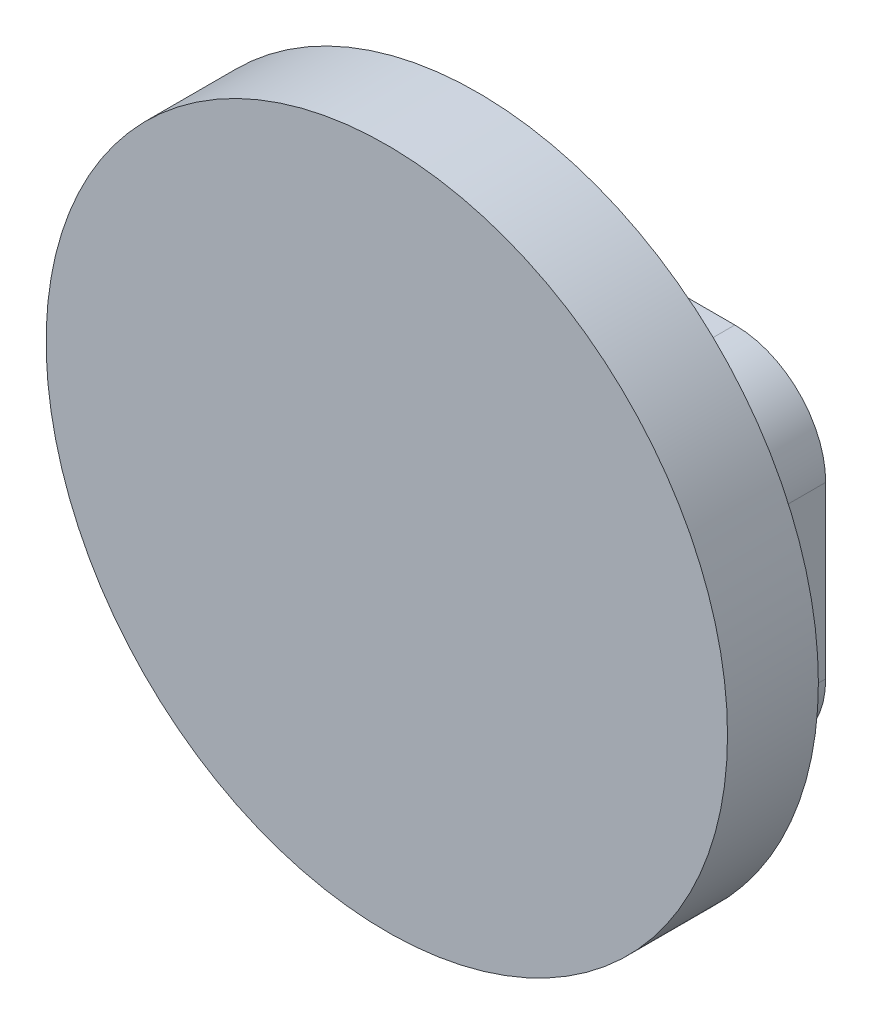
ISO-10303-21;
HEADER;
FILE_DESCRIPTION(('STEP AP214'),'2;1');
FILE_NAME('part.step','',(''),(''),'','','');
FILE_SCHEMA(('AUTOMOTIVE_DESIGN { 1 0 10303 214 1 1 1 1 }'));
ENDSEC;
DATA;
#1=APPLICATION_CONTEXT('core data for automotive mechanical design processes');
#2=APPLICATION_PROTOCOL_DEFINITION('international standard','automotive_design',2000,#1);
#3=PRODUCT_CONTEXT('',#1,'mechanical');
#4=PRODUCT('Part','Part','',(#3));
#5=PRODUCT_RELATED_PRODUCT_CATEGORY('part','',(#4));
#6=PRODUCT_DEFINITION_FORMATION('','',#4);
#7=PRODUCT_DEFINITION_CONTEXT('part definition',#1,'design');
#8=PRODUCT_DEFINITION('design','',#6,#7);
#9=PRODUCT_DEFINITION_SHAPE('','',#8);
#10=(LENGTH_UNIT() NAMED_UNIT(*) SI_UNIT(.MILLI.,.METRE.));
#11=(NAMED_UNIT(*) PLANE_ANGLE_UNIT() SI_UNIT($,.RADIAN.));
#12=(NAMED_UNIT(*) SI_UNIT($,.STERADIAN.) SOLID_ANGLE_UNIT());
#13=UNCERTAINTY_MEASURE_WITH_UNIT(LENGTH_MEASURE(1.E-05),#10,'distance_accuracy_value','');
#14=(GEOMETRIC_REPRESENTATION_CONTEXT(3) GLOBAL_UNCERTAINTY_ASSIGNED_CONTEXT((#13)) GLOBAL_UNIT_ASSIGNED_CONTEXT((#10,
#11,#12)) REPRESENTATION_CONTEXT('',''));
#15=CARTESIAN_POINT('',(0.,0.,0.));
#16=DIRECTION('',(0.,0.,1.));
#17=DIRECTION('',(1.,0.,0.));
#18=AXIS2_PLACEMENT_3D('',#15,#16,#17);
#19=CARTESIAN_POINT('',(11.9455168582029,0.,0.));
#20=DIRECTION('',(0.,0.,1.));
#21=DIRECTION('',(1.,0.,0.));
#22=AXIS2_PLACEMENT_3D('',#19,#20,#21);
#23=PLANE('',#22);
#24=CARTESIAN_POINT('',(11.9455168582029,0.,0.));
#25=DIRECTION('',(0.,0.,1.));
#26=DIRECTION('',(1.,0.,0.));
#27=AXIS2_PLACEMENT_3D('',#24,#25,#26);
#28=CIRCLE('',#27,37.5);
#29=CARTESIAN_POINT('',(49.445516858203,0.,0.));
#30=VERTEX_POINT('',#29);
#31=EDGE_CURVE('E44',#30,#30,#28,.T.);
#32=ORIENTED_EDGE('',*,*,#31,.F.);
#33=EDGE_LOOP('',(#32));
#34=FACE_BOUND('',#33,.T.);
#35=CARTESIAN_POINT('',(30.25,-9.24462078190565,0.));
#36=DIRECTION('',(0.,0.,-1.));
#37=DIRECTION('',(1.,0.,0.));
#38=AXIS2_PLACEMENT_3D('',#35,#36,#37);
#39=CIRCLE('',#38,10.);
#40=CARTESIAN_POINT('',(40.25,-9.24462078190565,0.));
#41=VERTEX_POINT('',#40);
#42=CARTESIAN_POINT('',(30.2392473184413,-19.2446150008959,0.));
#43=VERTEX_POINT('',#42);
#44=EDGE_CURVE('E57',#41,#43,#39,.T.);
#45=ORIENTED_EDGE('',*,*,#44,.F.);
#46=DIRECTION('',(0.,-1.,0.));
#47=VECTOR('',#46,1.);
#48=CARTESIAN_POINT('',(40.25,9.4843249413072,0.));
#49=LINE('',#48,#47);
#50=CARTESIAN_POINT('',(40.25,9.4843249413072,0.));
#51=VERTEX_POINT('',#50);
#52=EDGE_CURVE('E58',#51,#41,#49,.T.);
#53=ORIENTED_EDGE('',*,*,#52,.F.);
#54=CARTESIAN_POINT('',(30.25,9.4843249413072,0.));
#55=DIRECTION('',(0.,0.,-1.));
#56=DIRECTION('',(-1.,0.,0.));
#57=AXIS2_PLACEMENT_3D('',#54,#55,#56);
#58=CIRCLE('',#57,10.);
#59=CARTESIAN_POINT('',(30.25,19.4843249413072,0.));
#60=VERTEX_POINT('',#59);
#61=EDGE_CURVE('E202',#60,#51,#58,.T.);
#62=ORIENTED_EDGE('',*,*,#61,.F.);
#63=DIRECTION('',(1.,0.,0.));
#64=VECTOR('',#63,1.);
#65=CARTESIAN_POINT('',(30.25,19.4843249413072,0.));
#66=LINE('',#65,#64);
#67=CARTESIAN_POINT('',(-6.24999999999876,19.4843249413071,0.));
#68=VERTEX_POINT('',#67);
#69=EDGE_CURVE('E205',#68,#60,#66,.T.);
#70=ORIENTED_EDGE('',*,*,#69,.F.);
#71=CARTESIAN_POINT('',(-6.24999999999876,9.4843249413072,0.));
#72=DIRECTION('',(0.,0.,-1.));
#73=DIRECTION('',(1.,0.,0.));
#74=AXIS2_PLACEMENT_3D('',#71,#72,#73);
#75=CIRCLE('',#74,9.99999999999989);
#76=CARTESIAN_POINT('',(-16.2499999999985,9.4843249413072,0.));
#77=VERTEX_POINT('',#76);
#78=EDGE_CURVE('E200',#77,#68,#75,.T.);
#79=ORIENTED_EDGE('',*,*,#78,.F.);
#80=DIRECTION('',(0.,1.,0.));
#81=VECTOR('',#80,1.);
#82=CARTESIAN_POINT('',(-16.2499999999985,-9.20537347152766,0.));
#83=LINE('',#82,#81);
#84=CARTESIAN_POINT('',(-16.2499999999987,-9.20537347152766,0.));
#85=VERTEX_POINT('',#84);
#86=EDGE_CURVE('E198',#85,#77,#83,.T.);
#87=ORIENTED_EDGE('',*,*,#86,.F.);
#88=CARTESIAN_POINT('',(-6.24999999999876,-9.20537347152766,0.));
#89=DIRECTION('',(0.,0.,-1.));
#90=DIRECTION('',(1.,0.,0.));
#91=AXIS2_PLACEMENT_3D('',#88,#89,#90);
#92=CIRCLE('',#91,9.9999999999999);
#93=CARTESIAN_POINT('',(-6.26075268155724,-19.205367690518,0.));
#94=VERTEX_POINT('',#93);
#95=EDGE_CURVE('E191',#94,#85,#92,.T.);
#96=ORIENTED_EDGE('',*,*,#95,.F.);
#97=DIRECTION('',(-0.999999421899029,0.00107526815586501,0.));
#98=VECTOR('',#97,1.);
#99=CARTESIAN_POINT('',(30.2392473184413,-19.2446150008959,0.));
#100=LINE('',#99,#98);
#101=EDGE_CURVE('E187',#43,#94,#100,.T.);
#102=ORIENTED_EDGE('',*,*,#101,.F.);
#103=EDGE_LOOP('',(#45,#53,#62,#70,#79,#87,#96,#102));
#104=FACE_BOUND('',#103,.T.);
#105=ADVANCED_FACE('F41',(#34,#104),#23,.F.);
#106=CARTESIAN_POINT('',(11.9455168582029,0.,10.));
#107=DIRECTION('',(0.,0.,-1.));
#108=DIRECTION('',(-1.,0.,0.));
#109=AXIS2_PLACEMENT_3D('',#106,#107,#108);
#110=CYLINDRICAL_SURFACE('',#109,37.5);
#111=CARTESIAN_POINT('',(11.9455168582029,0.,10.));
#112=DIRECTION('',(0.,0.,1.));
#113=DIRECTION('',(1.,0.,0.));
#114=AXIS2_PLACEMENT_3D('',#111,#112,#113);
#115=CIRCLE('',#114,37.5);
#116=CARTESIAN_POINT('',(49.445516858203,0.,10.));
#117=VERTEX_POINT('',#116);
#118=EDGE_CURVE('E11',#117,#117,#115,.T.);
#119=ORIENTED_EDGE('',*,*,#118,.F.);
#120=EDGE_LOOP('',(#119));
#121=FACE_BOUND('',#120,.T.);
#122=ORIENTED_EDGE('',*,*,#31,.T.);
#123=EDGE_LOOP('',(#122));
#124=FACE_BOUND('',#123,.T.);
#125=ADVANCED_FACE('F43',(#121,#124),#110,.T.);
#126=CARTESIAN_POINT('',(11.9455168582029,0.,10.));
#127=DIRECTION('',(0.,0.,1.));
#128=DIRECTION('',(1.,0.,0.));
#129=AXIS2_PLACEMENT_3D('',#126,#127,#128);
#130=PLANE('',#129);
#131=ORIENTED_EDGE('',*,*,#118,.T.);
#132=EDGE_LOOP('',(#131));
#133=FACE_BOUND('',#132,.T.);
#134=ADVANCED_FACE('F245',(#133),#130,.T.);
#135=CARTESIAN_POINT('',(30.25,-9.24462078190565,-10.));
#136=DIRECTION('',(0.,0.,1.));
#137=DIRECTION('',(1.,0.,0.));
#138=AXIS2_PLACEMENT_3D('',#135,#136,#137);
#139=PLANE('',#138);
#140=CARTESIAN_POINT('',(30.25,-9.24462078190565,-10.));
#141=DIRECTION('',(0.,0.,-1.));
#142=DIRECTION('',(1.,0.,0.));
#143=AXIS2_PLACEMENT_3D('',#140,#141,#142);
#144=CIRCLE('',#143,10.);
#145=CARTESIAN_POINT('',(40.25,-9.24462078190565,-10.));
#146=VERTEX_POINT('',#145);
#147=CARTESIAN_POINT('',(30.2392473184413,-19.2446150008959,-10.));
#148=VERTEX_POINT('',#147);
#149=EDGE_CURVE('E174',#146,#148,#144,.T.);
#150=ORIENTED_EDGE('',*,*,#149,.T.);
#151=DIRECTION('',(-0.999999421899029,0.00107526815586501,0.));
#152=VECTOR('',#151,1.);
#153=CARTESIAN_POINT('',(30.2392473184413,-19.2446150008959,-10.));
#154=LINE('',#153,#152);
#155=CARTESIAN_POINT('',(-6.26075268155724,-19.205367690518,-10.));
#156=VERTEX_POINT('',#155);
#157=EDGE_CURVE('E173',#148,#156,#154,.T.);
#158=ORIENTED_EDGE('',*,*,#157,.T.);
#159=CARTESIAN_POINT('',(-6.24999999999876,-9.20537347152766,-10.));
#160=DIRECTION('',(0.,0.,-1.));
#161=DIRECTION('',(1.,0.,0.));
#162=AXIS2_PLACEMENT_3D('',#159,#160,#161);
#163=CIRCLE('',#162,9.9999999999999);
#164=CARTESIAN_POINT('',(-16.2499999999987,-9.20537347152766,-10.));
#165=VERTEX_POINT('',#164);
#166=EDGE_CURVE('E178',#156,#165,#163,.T.);
#167=ORIENTED_EDGE('',*,*,#166,.T.);
#168=DIRECTION('',(0.,1.,0.));
#169=VECTOR('',#168,1.);
#170=CARTESIAN_POINT('',(-16.2499999999985,-9.20537347152766,-10.));
#171=LINE('',#170,#169);
#172=CARTESIAN_POINT('',(-16.2499999999985,9.4843249413072,-10.));
#173=VERTEX_POINT('',#172);
#174=EDGE_CURVE('E176',#165,#173,#171,.T.);
#175=ORIENTED_EDGE('',*,*,#174,.T.);
#176=CARTESIAN_POINT('',(-6.24999999999876,9.4843249413072,-10.));
#177=DIRECTION('',(0.,0.,-1.));
#178=DIRECTION('',(1.,0.,0.));
#179=AXIS2_PLACEMENT_3D('',#176,#177,#178);
#180=CIRCLE('',#179,9.99999999999989);
#181=CARTESIAN_POINT('',(-6.24999999999876,19.4843249413071,-10.));
#182=VERTEX_POINT('',#181);
#183=EDGE_CURVE('E179',#173,#182,#180,.T.);
#184=ORIENTED_EDGE('',*,*,#183,.T.);
#185=DIRECTION('',(1.,0.,0.));
#186=VECTOR('',#185,1.);
#187=CARTESIAN_POINT('',(30.25,19.4843249413072,-10.));
#188=LINE('',#187,#186);
#189=CARTESIAN_POINT('',(30.25,19.4843249413072,-10.));
#190=VERTEX_POINT('',#189);
#191=EDGE_CURVE('E185',#182,#190,#188,.T.);
#192=ORIENTED_EDGE('',*,*,#191,.T.);
#193=CARTESIAN_POINT('',(30.25,9.4843249413072,-10.));
#194=DIRECTION('',(0.,0.,-1.));
#195=DIRECTION('',(-1.,0.,0.));
#196=AXIS2_PLACEMENT_3D('',#193,#194,#195);
#197=CIRCLE('',#196,10.);
#198=CARTESIAN_POINT('',(40.25,9.4843249413072,-10.));
#199=VERTEX_POINT('',#198);
#200=EDGE_CURVE('E184',#190,#199,#197,.T.);
#201=ORIENTED_EDGE('',*,*,#200,.T.);
#202=DIRECTION('',(0.,-1.,0.));
#203=VECTOR('',#202,1.);
#204=CARTESIAN_POINT('',(40.25,9.4843249413072,-10.));
#205=LINE('',#204,#203);
#206=EDGE_CURVE('E189',#199,#146,#205,.T.);
#207=ORIENTED_EDGE('',*,*,#206,.T.);
#208=EDGE_LOOP('',(#150,#158,#167,#175,#184,#192,#201,#207));
#209=FACE_BOUND('',#208,.T.);
#210=DIRECTION('',(1.,0.,0.));
#211=VECTOR('',#210,1.);
#212=CARTESIAN_POINT('',(35.25,14.4843249413072,-10.));
#213=LINE('',#212,#211);
#214=CARTESIAN_POINT('',(-11.2499999999986,14.4843249413072,-10.));
#215=VERTEX_POINT('',#214);
#216=CARTESIAN_POINT('',(35.25,14.4843249413072,-10.));
#217=VERTEX_POINT('',#216);
#218=EDGE_CURVE('E129',#215,#217,#213,.T.);
#219=ORIENTED_EDGE('',*,*,#218,.F.);
#220=DIRECTION('',(0.,1.,0.));
#221=VECTOR('',#220,1.);
#222=CARTESIAN_POINT('',(-11.2499999999986,-14.2000000181468,-10.));
#223=LINE('',#222,#221);
#224=CARTESIAN_POINT('',(-11.2499999999987,-14.2000000181468,-10.));
#225=VERTEX_POINT('',#224);
#226=EDGE_CURVE('E152',#225,#215,#223,.T.);
#227=ORIENTED_EDGE('',*,*,#226,.F.);
#228=DIRECTION('',(-0.999999421899029,0.00107526815586516,0.));
#229=VECTOR('',#228,1.);
#230=CARTESIAN_POINT('',(35.25,-14.2500000162996,-10.));
#231=LINE('',#230,#229);
#232=CARTESIAN_POINT('',(35.25,-14.2500000162996,-10.));
#233=VERTEX_POINT('',#232);
#234=EDGE_CURVE('E155',#233,#225,#231,.T.);
#235=ORIENTED_EDGE('',*,*,#234,.F.);
#236=DIRECTION('',(0.,-1.,0.));
#237=VECTOR('',#236,1.);
#238=CARTESIAN_POINT('',(35.25,14.4843249413072,-10.));
#239=LINE('',#238,#237);
#240=EDGE_CURVE('E137',#217,#233,#239,.T.);
#241=ORIENTED_EDGE('',*,*,#240,.F.);
#242=EDGE_LOOP('',(#219,#227,#235,#241));
#243=FACE_BOUND('',#242,.T.);
#244=ADVANCED_FACE('F147',(#209,#243),#139,.F.);
#245=CARTESIAN_POINT('',(30.25,-9.24462078190565,-10.));
#246=DIRECTION('',(0.,0.,1.));
#247=DIRECTION('',(1.,0.,0.));
#248=AXIS2_PLACEMENT_3D('',#245,#246,#247);
#249=CYLINDRICAL_SURFACE('',#248,10.);
#250=ORIENTED_EDGE('',*,*,#44,.T.);
#251=DIRECTION('',(0.,0.,1.));
#252=VECTOR('',#251,1.);
#253=CARTESIAN_POINT('',(30.2392473184413,-19.2446150008959,-10.));
#254=LINE('',#253,#252);
#255=EDGE_CURVE('E230',#148,#43,#254,.T.);
#256=ORIENTED_EDGE('',*,*,#255,.F.);
#257=ORIENTED_EDGE('',*,*,#149,.F.);
#258=DIRECTION('',(0.,0.,1.));
#259=VECTOR('',#258,1.);
#260=CARTESIAN_POINT('',(40.25,-9.24462078190565,-10.));
#261=LINE('',#260,#259);
#262=EDGE_CURVE('E190',#146,#41,#261,.T.);
#263=ORIENTED_EDGE('',*,*,#262,.T.);
#264=EDGE_LOOP('',(#250,#256,#257,#263));
#265=FACE_BOUND('',#264,.T.);
#266=ADVANCED_FACE('F268',(#265),#249,.T.);
#267=CARTESIAN_POINT('',(30.2392473184413,-19.2446150008959,-10.));
#268=DIRECTION('',(0.00107526815586501,0.999999421899029,0.));
#269=DIRECTION('',(-0.999999421899029,0.00107526815586501,0.));
#270=AXIS2_PLACEMENT_3D('',#267,#268,#269);
#271=PLANE('',#270);
#272=ORIENTED_EDGE('',*,*,#101,.T.);
#273=DIRECTION('',(0.,0.,1.));
#274=VECTOR('',#273,1.);
#275=CARTESIAN_POINT('',(-6.26075268155724,-19.205367690518,-10.));
#276=LINE('',#275,#274);
#277=EDGE_CURVE('E223',#156,#94,#276,.T.);
#278=ORIENTED_EDGE('',*,*,#277,.F.);
#279=ORIENTED_EDGE('',*,*,#157,.F.);
#280=ORIENTED_EDGE('',*,*,#255,.T.);
#281=EDGE_LOOP('',(#272,#278,#279,#280));
#282=FACE_BOUND('',#281,.T.);
#283=ADVANCED_FACE('F295',(#282),#271,.F.);
#284=CARTESIAN_POINT('',(-6.24999999999876,-9.20537347152766,-10.));
#285=DIRECTION('',(0.,0.,1.));
#286=DIRECTION('',(1.,0.,0.));
#287=AXIS2_PLACEMENT_3D('',#284,#285,#286);
#288=CYLINDRICAL_SURFACE('',#287,9.9999999999999);
#289=ORIENTED_EDGE('',*,*,#95,.T.);
#290=DIRECTION('',(0.,0.,1.));
#291=VECTOR('',#290,1.);
#292=CARTESIAN_POINT('',(-16.2499999999987,-9.20537347152766,-10.));
#293=LINE('',#292,#291);
#294=EDGE_CURVE('E225',#165,#85,#293,.T.);
#295=ORIENTED_EDGE('',*,*,#294,.F.);
#296=ORIENTED_EDGE('',*,*,#166,.F.);
#297=ORIENTED_EDGE('',*,*,#277,.T.);
#298=EDGE_LOOP('',(#289,#295,#296,#297));
#299=FACE_BOUND('',#298,.T.);
#300=ADVANCED_FACE('F286',(#299),#288,.T.);
#301=CARTESIAN_POINT('',(-16.2499999999985,-9.20537347152766,-10.));
#302=DIRECTION('',(1.,0.,0.));
#303=DIRECTION('',(0.,0.,-1.));
#304=AXIS2_PLACEMENT_3D('',#301,#302,#303);
#305=PLANE('',#304);
#306=ORIENTED_EDGE('',*,*,#86,.T.);
#307=DIRECTION('',(0.,0.,1.));
#308=VECTOR('',#307,1.);
#309=CARTESIAN_POINT('',(-16.2499999999985,9.4843249413072,-10.));
#310=LINE('',#309,#308);
#311=EDGE_CURVE('E218',#173,#77,#310,.T.);
#312=ORIENTED_EDGE('',*,*,#311,.F.);
#313=ORIENTED_EDGE('',*,*,#174,.F.);
#314=ORIENTED_EDGE('',*,*,#294,.T.);
#315=EDGE_LOOP('',(#306,#312,#313,#314));
#316=FACE_BOUND('',#315,.T.);
#317=ADVANCED_FACE('F283',(#316),#305,.F.);
#318=CARTESIAN_POINT('',(-6.24999999999876,9.4843249413072,-10.));
#319=DIRECTION('',(0.,0.,1.));
#320=DIRECTION('',(1.,0.,0.));
#321=AXIS2_PLACEMENT_3D('',#318,#319,#320);
#322=CYLINDRICAL_SURFACE('',#321,9.99999999999989);
#323=ORIENTED_EDGE('',*,*,#78,.T.);
#324=DIRECTION('',(0.,0.,1.));
#325=VECTOR('',#324,1.);
#326=CARTESIAN_POINT('',(-6.24999999999876,19.4843249413071,-10.));
#327=LINE('',#326,#325);
#328=EDGE_CURVE('E216',#182,#68,#327,.T.);
#329=ORIENTED_EDGE('',*,*,#328,.F.);
#330=ORIENTED_EDGE('',*,*,#183,.F.);
#331=ORIENTED_EDGE('',*,*,#311,.T.);
#332=EDGE_LOOP('',(#323,#329,#330,#331));
#333=FACE_BOUND('',#332,.T.);
#334=ADVANCED_FACE('F278',(#333),#322,.T.);
#335=CARTESIAN_POINT('',(30.25,19.4843249413072,-10.));
#336=DIRECTION('',(0.,-1.,0.));
#337=DIRECTION('',(0.,0.,-1.));
#338=AXIS2_PLACEMENT_3D('',#335,#336,#337);
#339=PLANE('',#338);
#340=ORIENTED_EDGE('',*,*,#69,.T.);
#341=DIRECTION('',(0.,0.,1.));
#342=VECTOR('',#341,1.);
#343=CARTESIAN_POINT('',(30.25,19.4843249413072,-10.));
#344=LINE('',#343,#342);
#345=EDGE_CURVE('E213',#190,#60,#344,.T.);
#346=ORIENTED_EDGE('',*,*,#345,.F.);
#347=ORIENTED_EDGE('',*,*,#191,.F.);
#348=ORIENTED_EDGE('',*,*,#328,.T.);
#349=EDGE_LOOP('',(#340,#346,#347,#348));
#350=FACE_BOUND('',#349,.T.);
#351=ADVANCED_FACE('F277',(#350),#339,.F.);
#352=CARTESIAN_POINT('',(30.25,9.4843249413072,-10.));
#353=DIRECTION('',(0.,0.,1.));
#354=DIRECTION('',(1.,0.,0.));
#355=AXIS2_PLACEMENT_3D('',#352,#353,#354);
#356=CYLINDRICAL_SURFACE('',#355,10.);
#357=ORIENTED_EDGE('',*,*,#61,.T.);
#358=DIRECTION('',(0.,0.,1.));
#359=VECTOR('',#358,1.);
#360=CARTESIAN_POINT('',(40.25,9.4843249413072,-10.));
#361=LINE('',#360,#359);
#362=EDGE_CURVE('E209',#199,#51,#361,.T.);
#363=ORIENTED_EDGE('',*,*,#362,.F.);
#364=ORIENTED_EDGE('',*,*,#200,.F.);
#365=ORIENTED_EDGE('',*,*,#345,.T.);
#366=EDGE_LOOP('',(#357,#363,#364,#365));
#367=FACE_BOUND('',#366,.T.);
#368=ADVANCED_FACE('F275',(#367),#356,.T.);
#369=CARTESIAN_POINT('',(40.25,9.4843249413072,-10.));
#370=DIRECTION('',(-1.,0.,0.));
#371=DIRECTION('',(0.,0.,1.));
#372=AXIS2_PLACEMENT_3D('',#369,#370,#371);
#373=PLANE('',#372);
#374=ORIENTED_EDGE('',*,*,#52,.T.);
#375=ORIENTED_EDGE('',*,*,#262,.F.);
#376=ORIENTED_EDGE('',*,*,#206,.F.);
#377=ORIENTED_EDGE('',*,*,#362,.T.);
#378=EDGE_LOOP('',(#374,#375,#376,#377));
#379=FACE_BOUND('',#378,.T.);
#380=ADVANCED_FACE('F266',(#379),#373,.F.);
#381=CARTESIAN_POINT('',(35.25,14.4843249413072,-10.));
#382=DIRECTION('',(0.,-1.,0.));
#383=DIRECTION('',(1.,0.,0.));
#384=AXIS2_PLACEMENT_3D('',#381,#382,#383);
#385=PLANE('',#384);
#386=DIRECTION('',(1.,0.,0.));
#387=VECTOR('',#386,1.);
#388=CARTESIAN_POINT('',(35.25,14.4843249413072,0.));
#389=LINE('',#388,#387);
#390=CARTESIAN_POINT('',(-11.2499999999987,14.4843249413072,0.));
#391=VERTEX_POINT('',#390);
#392=CARTESIAN_POINT('',(35.25,14.4843249413072,0.));
#393=VERTEX_POINT('',#392);
#394=EDGE_CURVE('E158',#391,#393,#389,.T.);
#395=ORIENTED_EDGE('',*,*,#394,.F.);
#396=DIRECTION('',(0.,0.,1.));
#397=VECTOR('',#396,1.);
#398=CARTESIAN_POINT('',(-11.2499999999986,14.4843249413072,-10.));
#399=LINE('',#398,#397);
#400=EDGE_CURVE('E132',#215,#391,#399,.T.);
#401=ORIENTED_EDGE('',*,*,#400,.F.);
#402=ORIENTED_EDGE('',*,*,#218,.T.);
#403=DIRECTION('',(0.,0.,1.));
#404=VECTOR('',#403,1.);
#405=CARTESIAN_POINT('',(35.25,14.4843249413072,-10.));
#406=LINE('',#405,#404);
#407=EDGE_CURVE('E131',#217,#393,#406,.T.);
#408=ORIENTED_EDGE('',*,*,#407,.T.);
#409=EDGE_LOOP('',(#395,#401,#402,#408));
#410=FACE_BOUND('',#409,.T.);
#411=ADVANCED_FACE('F134',(#410),#385,.T.);
#412=CARTESIAN_POINT('',(35.25,14.4843249413072,-10.));
#413=DIRECTION('',(-1.,0.,0.));
#414=DIRECTION('',(0.,-1.,0.));
#415=AXIS2_PLACEMENT_3D('',#412,#413,#414);
#416=PLANE('',#415);
#417=DIRECTION('',(0.,-1.,0.));
#418=VECTOR('',#417,1.);
#419=CARTESIAN_POINT('',(35.25,14.4843249413072,0.));
#420=LINE('',#419,#418);
#421=CARTESIAN_POINT('',(35.25,-14.2500000162996,0.));
#422=VERTEX_POINT('',#421);
#423=EDGE_CURVE('E148',#393,#422,#420,.T.);
#424=ORIENTED_EDGE('',*,*,#423,.F.);
#425=ORIENTED_EDGE('',*,*,#407,.F.);
#426=ORIENTED_EDGE('',*,*,#240,.T.);
#427=DIRECTION('',(0.,0.,1.));
#428=VECTOR('',#427,1.);
#429=CARTESIAN_POINT('',(35.25,-14.2500000162996,-10.));
#430=LINE('',#429,#428);
#431=EDGE_CURVE('E150',#233,#422,#430,.T.);
#432=ORIENTED_EDGE('',*,*,#431,.T.);
#433=EDGE_LOOP('',(#424,#425,#426,#432));
#434=FACE_BOUND('',#433,.T.);
#435=ADVANCED_FACE('F141',(#434),#416,.T.);
#436=CARTESIAN_POINT('',(35.25,-14.2500000162996,-10.));
#437=DIRECTION('',(0.00107526815586516,0.999999421899029,0.));
#438=DIRECTION('',(-0.999999421899029,0.00107526815586516,0.));
#439=AXIS2_PLACEMENT_3D('',#436,#437,#438);
#440=PLANE('',#439);
#441=DIRECTION('',(-0.999999421899029,0.00107526815586516,0.));
#442=VECTOR('',#441,1.);
#443=CARTESIAN_POINT('',(35.25,-14.2500000162996,0.));
#444=LINE('',#443,#442);
#445=CARTESIAN_POINT('',(-11.2499999999986,-14.2000000181468,0.));
#446=VERTEX_POINT('',#445);
#447=EDGE_CURVE('E161',#422,#446,#444,.T.);
#448=ORIENTED_EDGE('',*,*,#447,.F.);
#449=ORIENTED_EDGE('',*,*,#431,.F.);
#450=ORIENTED_EDGE('',*,*,#234,.T.);
#451=DIRECTION('',(0.,0.,1.));
#452=VECTOR('',#451,1.);
#453=CARTESIAN_POINT('',(-11.2499999999986,-14.2000000181468,-10.));
#454=LINE('',#453,#452);
#455=EDGE_CURVE('E170',#225,#446,#454,.T.);
#456=ORIENTED_EDGE('',*,*,#455,.T.);
#457=EDGE_LOOP('',(#448,#449,#450,#456));
#458=FACE_BOUND('',#457,.T.);
#459=ADVANCED_FACE('F252',(#458),#440,.T.);
#460=CARTESIAN_POINT('',(-11.2499999999986,-14.2000000181468,-10.));
#461=DIRECTION('',(1.,0.,0.));
#462=DIRECTION('',(0.,0.,-1.));
#463=AXIS2_PLACEMENT_3D('',#460,#461,#462);
#464=PLANE('',#463);
#465=DIRECTION('',(0.,1.,0.));
#466=VECTOR('',#465,1.);
#467=CARTESIAN_POINT('',(-11.2499999999986,-14.2000000181468,0.));
#468=LINE('',#467,#466);
#469=EDGE_CURVE('E139',#446,#391,#468,.T.);
#470=ORIENTED_EDGE('',*,*,#469,.F.);
#471=ORIENTED_EDGE('',*,*,#455,.F.);
#472=ORIENTED_EDGE('',*,*,#226,.T.);
#473=ORIENTED_EDGE('',*,*,#400,.T.);
#474=EDGE_LOOP('',(#470,#471,#472,#473));
#475=FACE_BOUND('',#474,.T.);
#476=ADVANCED_FACE('F250',(#475),#464,.T.);
#477=ORIENTED_EDGE('',*,*,#447,.T.);
#478=ORIENTED_EDGE('',*,*,#469,.T.);
#479=ORIENTED_EDGE('',*,*,#394,.T.);
#480=ORIENTED_EDGE('',*,*,#423,.T.);
#481=EDGE_LOOP('',(#477,#478,#479,#480));
#482=FACE_BOUND('',#481,.T.);
#483=ADVANCED_FACE('F240',(#482),#23,.F.);
#484=CLOSED_SHELL('',(#105,#125,#134,#244,#266,#283,#300,#317,#334,#351,#368,#380,#411,#435,
#459,#476,#483));
#485=MANIFOLD_SOLID_BREP('B2',#484);
#486=ADVANCED_BREP_SHAPE_REPRESENTATION('',(#18,#485),#14);
#487=SHAPE_DEFINITION_REPRESENTATION(#9,#486);
ENDSEC;
END-ISO-10303-21;
